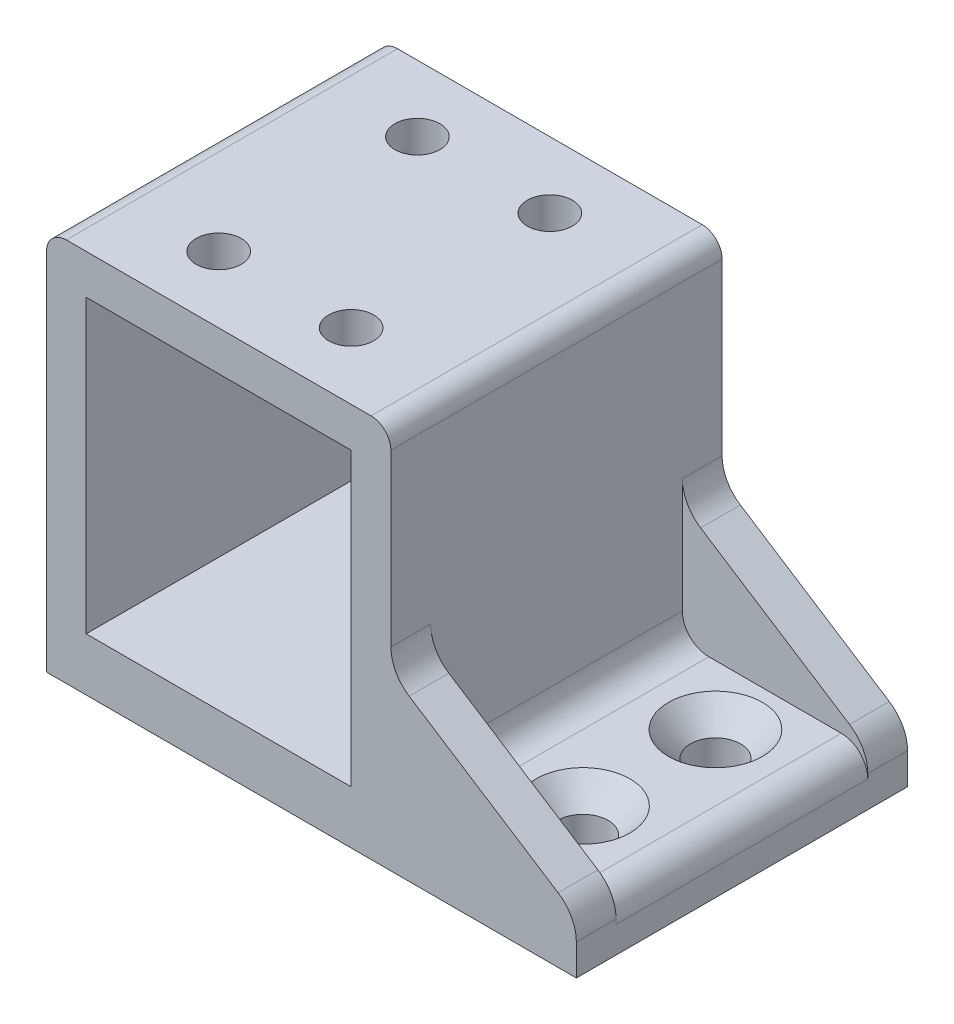
ISO-10303-21;
HEADER;
FILE_DESCRIPTION(('STEP AP214'),'2;1');
FILE_NAME('part.step','',(''),(''),'','','');
FILE_SCHEMA(('AUTOMOTIVE_DESIGN { 1 0 10303 214 1 1 1 1 }'));
ENDSEC;
DATA;
#1=APPLICATION_CONTEXT('core data for automotive mechanical design processes');
#2=APPLICATION_PROTOCOL_DEFINITION('international standard','automotive_design',2000,#1);
#3=PRODUCT_CONTEXT('',#1,'mechanical');
#4=PRODUCT('Part','Part','',(#3));
#5=PRODUCT_RELATED_PRODUCT_CATEGORY('part','',(#4));
#6=PRODUCT_DEFINITION_FORMATION('','',#4);
#7=PRODUCT_DEFINITION_CONTEXT('part definition',#1,'design');
#8=PRODUCT_DEFINITION('design','',#6,#7);
#9=PRODUCT_DEFINITION_SHAPE('','',#8);
#10=(LENGTH_UNIT() NAMED_UNIT(*) SI_UNIT(.MILLI.,.METRE.));
#11=(NAMED_UNIT(*) PLANE_ANGLE_UNIT() SI_UNIT($,.RADIAN.));
#12=(NAMED_UNIT(*) SI_UNIT($,.STERADIAN.) SOLID_ANGLE_UNIT());
#13=UNCERTAINTY_MEASURE_WITH_UNIT(LENGTH_MEASURE(1.E-05),#10,'distance_accuracy_value','');
#14=(GEOMETRIC_REPRESENTATION_CONTEXT(3) GLOBAL_UNCERTAINTY_ASSIGNED_CONTEXT((#13)) GLOBAL_UNIT_ASSIGNED_CONTEXT((#10,
#11,#12)) REPRESENTATION_CONTEXT('',''));
#15=CARTESIAN_POINT('',(0.,0.,0.));
#16=DIRECTION('',(0.,0.,1.));
#17=DIRECTION('',(1.,0.,0.));
#18=AXIS2_PLACEMENT_3D('',#15,#16,#17);
#19=CARTESIAN_POINT('',(0.,0.,25.));
#20=DIRECTION('',(-1.,0.,0.));
#21=DIRECTION('',(0.,0.,1.));
#22=AXIS2_PLACEMENT_3D('',#19,#20,#21);
#23=PLANE('',#22);
#24=DIRECTION('',(0.,1.,0.));
#25=VECTOR('',#24,1.);
#26=CARTESIAN_POINT('',(0.,0.,0.));
#27=LINE('',#26,#25);
#28=CARTESIAN_POINT('',(0.,10.6378536379485,0.));
#29=VERTEX_POINT('',#28);
#30=CARTESIAN_POINT('',(0.,23.5,0.));
#31=VERTEX_POINT('',#30);
#32=EDGE_CURVE('E202',#29,#31,#27,.T.);
#33=ORIENTED_EDGE('',*,*,#32,.T.);
#34=DIRECTION('',(0.,0.,-1.));
#35=VECTOR('',#34,1.);
#36=CARTESIAN_POINT('',(0.,23.5,25.));
#37=LINE('',#36,#35);
#38=CARTESIAN_POINT('',(0.,23.5,25.));
#39=VERTEX_POINT('',#38);
#40=EDGE_CURVE('E11',#31,#39,#37,.F.);
#41=ORIENTED_EDGE('',*,*,#40,.T.);
#42=DIRECTION('',(0.,1.,0.));
#43=VECTOR('',#42,1.);
#44=CARTESIAN_POINT('',(0.,0.,25.));
#45=LINE('',#44,#43);
#46=CARTESIAN_POINT('',(0.,10.6378536379485,25.));
#47=VERTEX_POINT('',#46);
#48=EDGE_CURVE('E228',#47,#39,#45,.T.);
#49=ORIENTED_EDGE('',*,*,#48,.F.);
#50=DIRECTION('',(0.,0.,1.));
#51=VECTOR('',#50,1.);
#52=CARTESIAN_POINT('',(0.,10.6378536379485,25.));
#53=LINE('',#52,#51);
#54=CARTESIAN_POINT('',(0.,10.6378536379485,22.));
#55=VERTEX_POINT('',#54);
#56=EDGE_CURVE('E255',#47,#55,#53,.F.);
#57=ORIENTED_EDGE('',*,*,#56,.T.);
#58=DIRECTION('',(0.,-1.,0.));
#59=VECTOR('',#58,1.);
#60=CARTESIAN_POINT('',(0.,0.,22.));
#61=LINE('',#60,#59);
#62=CARTESIAN_POINT('',(0.,2.,22.));
#63=VERTEX_POINT('',#62);
#64=EDGE_CURVE('E365',#55,#63,#61,.T.);
#65=ORIENTED_EDGE('',*,*,#64,.T.);
#66=DIRECTION('',(0.,0.,-1.));
#67=VECTOR('',#66,1.);
#68=CARTESIAN_POINT('',(0.,2.,3.));
#69=LINE('',#68,#67);
#70=CARTESIAN_POINT('',(0.,2.,3.));
#71=VERTEX_POINT('',#70);
#72=EDGE_CURVE('E278',#63,#71,#69,.T.);
#73=ORIENTED_EDGE('',*,*,#72,.T.);
#74=DIRECTION('',(0.,-1.,0.));
#75=VECTOR('',#74,1.);
#76=CARTESIAN_POINT('',(0.,9.,3.));
#77=LINE('',#76,#75);
#78=CARTESIAN_POINT('',(0.,10.6378536379485,3.));
#79=VERTEX_POINT('',#78);
#80=EDGE_CURVE('E356',#79,#71,#77,.T.);
#81=ORIENTED_EDGE('',*,*,#80,.F.);
#82=DIRECTION('',(0.,0.,-1.));
#83=VECTOR('',#82,1.);
#84=CARTESIAN_POINT('',(0.,10.6378536379485,0.));
#85=LINE('',#84,#83);
#86=EDGE_CURVE('E258',#79,#29,#85,.T.);
#87=ORIENTED_EDGE('',*,*,#86,.T.);
#88=EDGE_LOOP('',(#33,#41,#49,#57,#65,#73,#81,#87));
#89=FACE_BOUND('',#88,.T.);
#90=ADVANCED_FACE('F32',(#89),#23,.F.);
#91=CARTESIAN_POINT('',(0.,0.,25.));
#92=DIRECTION('',(0.,0.,-1.));
#93=DIRECTION('',(-1.,0.,0.));
#94=AXIS2_PLACEMENT_3D('',#91,#92,#93);
#95=PLANE('',#94);
#96=DIRECTION('',(-1.,0.,0.));
#97=VECTOR('',#96,1.);
#98=CARTESIAN_POINT('',(0.,25.,25.));
#99=LINE('',#98,#97);
#100=CARTESIAN_POINT('',(-1.5,25.,25.));
#101=VERTEX_POINT('',#100);
#102=CARTESIAN_POINT('',(-24.5,25.,25.));
#103=VERTEX_POINT('',#102);
#104=EDGE_CURVE('E230',#101,#103,#99,.T.);
#105=ORIENTED_EDGE('',*,*,#104,.T.);
#106=CARTESIAN_POINT('',(-24.5,23.5,25.));
#107=DIRECTION('',(0.,0.,-1.));
#108=DIRECTION('',(-1.,0.,0.));
#109=AXIS2_PLACEMENT_3D('',#106,#107,#108);
#110=CIRCLE('',#109,1.5);
#111=CARTESIAN_POINT('',(-26.,23.5,25.));
#112=VERTEX_POINT('',#111);
#113=EDGE_CURVE('E40',#103,#112,#110,.F.);
#114=ORIENTED_EDGE('',*,*,#113,.T.);
#115=DIRECTION('',(0.,-1.,0.));
#116=VECTOR('',#115,1.);
#117=CARTESIAN_POINT('',(-26.,25.,25.));
#118=LINE('',#117,#116);
#119=CARTESIAN_POINT('',(-26.,-4.,25.));
#120=VERTEX_POINT('',#119);
#121=EDGE_CURVE('E233',#112,#120,#118,.T.);
#122=ORIENTED_EDGE('',*,*,#121,.T.);
#123=DIRECTION('',(1.,0.,0.));
#124=VECTOR('',#123,1.);
#125=CARTESIAN_POINT('',(-26.,-4.,25.));
#126=LINE('',#125,#124);
#127=CARTESIAN_POINT('',(14.,-4.,25.));
#128=VERTEX_POINT('',#127);
#129=EDGE_CURVE('E235',#120,#128,#126,.T.);
#130=ORIENTED_EDGE('',*,*,#129,.T.);
#131=DIRECTION('',(0.,1.,0.));
#132=VECTOR('',#131,1.);
#133=CARTESIAN_POINT('',(14.,-4.,25.));
#134=LINE('',#133,#132);
#135=CARTESIAN_POINT('',(14.,-1.63785363794855,25.));
#136=VERTEX_POINT('',#135);
#137=EDGE_CURVE('E237',#128,#136,#134,.T.);
#138=ORIENTED_EDGE('',*,*,#137,.T.);
#139=CARTESIAN_POINT('',(11.,-1.63785363794855,25.));
#140=DIRECTION('',(0.,0.,-1.));
#141=DIRECTION('',(-1.,0.,0.));
#142=AXIS2_PLACEMENT_3D('',#139,#140,#141);
#143=CIRCLE('',#142,3.);
#144=CARTESIAN_POINT('',(12.6222727739405,0.885681788181112,25.));
#145=VERTEX_POINT('',#144);
#146=EDGE_CURVE('E319',#136,#145,#143,.F.);
#147=ORIENTED_EDGE('',*,*,#146,.T.);
#148=DIRECTION('',(-0.841178475376554,0.540757591313499,0.));
#149=VECTOR('',#148,1.);
#150=CARTESIAN_POINT('',(4.09386281588448,6.36823104693141,25.));
#151=LINE('',#150,#149);
#152=CARTESIAN_POINT('',(1.3777272260595,8.11431821181889,25.));
#153=VERTEX_POINT('',#152);
#154=EDGE_CURVE('E375',#145,#153,#151,.T.);
#155=ORIENTED_EDGE('',*,*,#154,.T.);
#156=CARTESIAN_POINT('',(3.,10.6378536379485,25.));
#157=DIRECTION('',(0.,0.,-1.));
#158=DIRECTION('',(-1.,0.,0.));
#159=AXIS2_PLACEMENT_3D('',#156,#157,#158);
#160=CIRCLE('',#159,3.);
#161=EDGE_CURVE('E273',#153,#47,#160,.T.);
#162=ORIENTED_EDGE('',*,*,#161,.T.);
#163=ORIENTED_EDGE('',*,*,#48,.T.);
#164=CARTESIAN_POINT('',(-1.5,23.5,25.));
#165=DIRECTION('',(0.,0.,-1.));
#166=DIRECTION('',(-1.,0.,0.));
#167=AXIS2_PLACEMENT_3D('',#164,#165,#166);
#168=CIRCLE('',#167,1.5);
#169=EDGE_CURVE('E332',#39,#101,#168,.F.);
#170=ORIENTED_EDGE('',*,*,#169,.T.);
#171=EDGE_LOOP('',(#105,#114,#122,#130,#138,#147,#155,#162,#163,#170));
#172=FACE_BOUND('',#171,.T.);
#173=DIRECTION('',(-1.,0.,0.));
#174=VECTOR('',#173,1.);
#175=CARTESIAN_POINT('',(-3.,22.,25.));
#176=LINE('',#175,#174);
#177=CARTESIAN_POINT('',(-3.,22.,25.));
#178=VERTEX_POINT('',#177);
#179=CARTESIAN_POINT('',(-23.,22.,25.));
#180=VERTEX_POINT('',#179);
#181=EDGE_CURVE('E184',#178,#180,#176,.T.);
#182=ORIENTED_EDGE('',*,*,#181,.F.);
#183=DIRECTION('',(0.,1.,0.));
#184=VECTOR('',#183,1.);
#185=CARTESIAN_POINT('',(-3.,22.,25.));
#186=LINE('',#185,#184);
#187=CARTESIAN_POINT('',(-3.,0.,25.));
#188=VERTEX_POINT('',#187);
#189=EDGE_CURVE('E210',#188,#178,#186,.T.);
#190=ORIENTED_EDGE('',*,*,#189,.F.);
#191=DIRECTION('',(1.,0.,0.));
#192=VECTOR('',#191,1.);
#193=CARTESIAN_POINT('',(-23.,0.,25.));
#194=LINE('',#193,#192);
#195=CARTESIAN_POINT('',(-23.,0.,25.));
#196=VERTEX_POINT('',#195);
#197=EDGE_CURVE('E208',#196,#188,#194,.T.);
#198=ORIENTED_EDGE('',*,*,#197,.F.);
#199=DIRECTION('',(0.,-1.,0.));
#200=VECTOR('',#199,1.);
#201=CARTESIAN_POINT('',(-23.,22.,25.));
#202=LINE('',#201,#200);
#203=EDGE_CURVE('E194',#180,#196,#202,.T.);
#204=ORIENTED_EDGE('',*,*,#203,.F.);
#205=EDGE_LOOP('',(#182,#190,#198,#204));
#206=FACE_BOUND('',#205,.T.);
#207=ADVANCED_FACE('F206',(#172,#206),#95,.F.);
#208=CARTESIAN_POINT('',(0.,0.,0.));
#209=DIRECTION('',(0.,0.,-1.));
#210=DIRECTION('',(-1.,0.,0.));
#211=AXIS2_PLACEMENT_3D('',#208,#209,#210);
#212=PLANE('',#211);
#213=DIRECTION('',(0.,-1.,0.));
#214=VECTOR('',#213,1.);
#215=CARTESIAN_POINT('',(-26.,25.,0.));
#216=LINE('',#215,#214);
#217=CARTESIAN_POINT('',(-26.,23.5,0.));
#218=VERTEX_POINT('',#217);
#219=CARTESIAN_POINT('',(-26.,-4.,0.));
#220=VERTEX_POINT('',#219);
#221=EDGE_CURVE('E244',#218,#220,#216,.T.);
#222=ORIENTED_EDGE('',*,*,#221,.F.);
#223=CARTESIAN_POINT('',(-24.5,23.5,0.));
#224=DIRECTION('',(0.,0.,-1.));
#225=DIRECTION('',(-1.,0.,0.));
#226=AXIS2_PLACEMENT_3D('',#223,#224,#225);
#227=CIRCLE('',#226,1.5);
#228=CARTESIAN_POINT('',(-24.5,25.,0.));
#229=VERTEX_POINT('',#228);
#230=EDGE_CURVE('E326',#218,#229,#227,.T.);
#231=ORIENTED_EDGE('',*,*,#230,.T.);
#232=DIRECTION('',(-1.,0.,0.));
#233=VECTOR('',#232,1.);
#234=CARTESIAN_POINT('',(0.,25.,0.));
#235=LINE('',#234,#233);
#236=CARTESIAN_POINT('',(-1.5,25.,0.));
#237=VERTEX_POINT('',#236);
#238=EDGE_CURVE('E242',#237,#229,#235,.T.);
#239=ORIENTED_EDGE('',*,*,#238,.F.);
#240=CARTESIAN_POINT('',(-1.5,23.5,0.));
#241=DIRECTION('',(0.,0.,-1.));
#242=DIRECTION('',(-1.,0.,0.));
#243=AXIS2_PLACEMENT_3D('',#240,#241,#242);
#244=CIRCLE('',#243,1.5);
#245=EDGE_CURVE('E324',#237,#31,#244,.T.);
#246=ORIENTED_EDGE('',*,*,#245,.T.);
#247=ORIENTED_EDGE('',*,*,#32,.F.);
#248=CARTESIAN_POINT('',(3.,10.6378536379485,0.));
#249=DIRECTION('',(0.,0.,-1.));
#250=DIRECTION('',(-1.,0.,0.));
#251=AXIS2_PLACEMENT_3D('',#248,#249,#250);
#252=CIRCLE('',#251,3.);
#253=CARTESIAN_POINT('',(1.37772722605951,8.11431821181889,0.));
#254=VERTEX_POINT('',#253);
#255=EDGE_CURVE('E267',#29,#254,#252,.F.);
#256=ORIENTED_EDGE('',*,*,#255,.T.);
#257=DIRECTION('',(-0.841178475376554,0.540757591313499,0.));
#258=VECTOR('',#257,1.);
#259=CARTESIAN_POINT('',(14.,0.,0.));
#260=LINE('',#259,#258);
#261=CARTESIAN_POINT('',(12.6222727739405,0.88568178818111,0.));
#262=VERTEX_POINT('',#261);
#263=EDGE_CURVE('E362',#262,#254,#260,.T.);
#264=ORIENTED_EDGE('',*,*,#263,.F.);
#265=CARTESIAN_POINT('',(11.,-1.63785363794855,0.));
#266=DIRECTION('',(0.,0.,-1.));
#267=DIRECTION('',(-1.,0.,0.));
#268=AXIS2_PLACEMENT_3D('',#265,#266,#267);
#269=CIRCLE('',#268,3.);
#270=CARTESIAN_POINT('',(14.,-1.63785363794855,0.));
#271=VERTEX_POINT('',#270);
#272=EDGE_CURVE('E306',#262,#271,#269,.T.);
#273=ORIENTED_EDGE('',*,*,#272,.T.);
#274=DIRECTION('',(0.,1.,0.));
#275=VECTOR('',#274,1.);
#276=CARTESIAN_POINT('',(14.,-4.,0.));
#277=LINE('',#276,#275);
#278=CARTESIAN_POINT('',(14.,-4.,0.));
#279=VERTEX_POINT('',#278);
#280=EDGE_CURVE('E231',#279,#271,#277,.T.);
#281=ORIENTED_EDGE('',*,*,#280,.F.);
#282=DIRECTION('',(1.,0.,0.));
#283=VECTOR('',#282,1.);
#284=CARTESIAN_POINT('',(-26.,-4.,0.));
#285=LINE('',#284,#283);
#286=EDGE_CURVE('E246',#220,#279,#285,.T.);
#287=ORIENTED_EDGE('',*,*,#286,.F.);
#288=EDGE_LOOP('',(#222,#231,#239,#246,#247,#256,#264,#273,#281,#287));
#289=FACE_BOUND('',#288,.T.);
#290=DIRECTION('',(0.,1.,0.));
#291=VECTOR('',#290,1.);
#292=CARTESIAN_POINT('',(-3.,22.,0.));
#293=LINE('',#292,#291);
#294=CARTESIAN_POINT('',(-3.,0.,0.));
#295=VERTEX_POINT('',#294);
#296=CARTESIAN_POINT('',(-3.,22.,0.));
#297=VERTEX_POINT('',#296);
#298=EDGE_CURVE('E195',#295,#297,#293,.T.);
#299=ORIENTED_EDGE('',*,*,#298,.T.);
#300=DIRECTION('',(-1.,0.,0.));
#301=VECTOR('',#300,1.);
#302=CARTESIAN_POINT('',(-3.,22.,0.));
#303=LINE('',#302,#301);
#304=CARTESIAN_POINT('',(-23.,22.,0.));
#305=VERTEX_POINT('',#304);
#306=EDGE_CURVE('E215',#297,#305,#303,.T.);
#307=ORIENTED_EDGE('',*,*,#306,.T.);
#308=DIRECTION('',(0.,-1.,0.));
#309=VECTOR('',#308,1.);
#310=CARTESIAN_POINT('',(-23.,22.,0.));
#311=LINE('',#310,#309);
#312=CARTESIAN_POINT('',(-23.,0.,0.));
#313=VERTEX_POINT('',#312);
#314=EDGE_CURVE('E201',#305,#313,#311,.T.);
#315=ORIENTED_EDGE('',*,*,#314,.T.);
#316=DIRECTION('',(1.,0.,0.));
#317=VECTOR('',#316,1.);
#318=CARTESIAN_POINT('',(-23.,0.,0.));
#319=LINE('',#318,#317);
#320=EDGE_CURVE('E219',#313,#295,#319,.T.);
#321=ORIENTED_EDGE('',*,*,#320,.T.);
#322=EDGE_LOOP('',(#299,#307,#315,#321));
#323=FACE_BOUND('',#322,.T.);
#324=ADVANCED_FACE('F346',(#289,#323),#212,.T.);
#325=CARTESIAN_POINT('',(14.,0.,25.));
#326=DIRECTION('',(0.,-1.,0.));
#327=DIRECTION('',(1.,0.,0.));
#328=AXIS2_PLACEMENT_3D('',#325,#326,#327);
#329=PLANE('',#328);
#330=CARTESIAN_POINT('',(7.,0.,17.5));
#331=DIRECTION('',(0.,1.,0.));
#332=DIRECTION('',(0.,0.,1.));
#333=AXIS2_PLACEMENT_3D('',#330,#331,#332);
#334=CIRCLE('',#333,3.5433);
#335=CARTESIAN_POINT('',(7.,0.,21.0433));
#336=VERTEX_POINT('',#335);
#337=EDGE_CURVE('E420',#336,#336,#334,.T.);
#338=ORIENTED_EDGE('',*,*,#337,.F.);
#339=EDGE_LOOP('',(#338));
#340=FACE_BOUND('',#339,.T.);
#341=CARTESIAN_POINT('',(7.,0.,7.5));
#342=DIRECTION('',(0.,1.,0.));
#343=DIRECTION('',(0.,0.,1.));
#344=AXIS2_PLACEMENT_3D('',#341,#342,#343);
#345=CIRCLE('',#344,3.5433);
#346=CARTESIAN_POINT('',(7.,0.,11.0433));
#347=VERTEX_POINT('',#346);
#348=EDGE_CURVE('E411',#347,#347,#345,.T.);
#349=ORIENTED_EDGE('',*,*,#348,.F.);
#350=EDGE_LOOP('',(#349));
#351=FACE_BOUND('',#350,.T.);
#352=DIRECTION('',(1.,0.,0.));
#353=VECTOR('',#352,1.);
#354=CARTESIAN_POINT('',(0.,0.,3.));
#355=LINE('',#354,#353);
#356=CARTESIAN_POINT('',(2.,0.,3.));
#357=VERTEX_POINT('',#356);
#358=CARTESIAN_POINT('',(12.,0.,3.));
#359=VERTEX_POINT('',#358);
#360=EDGE_CURVE('E366',#357,#359,#355,.T.);
#361=ORIENTED_EDGE('',*,*,#360,.F.);
#362=DIRECTION('',(0.,0.,-1.));
#363=VECTOR('',#362,1.);
#364=CARTESIAN_POINT('',(2.,0.,22.));
#365=LINE('',#364,#363);
#366=CARTESIAN_POINT('',(2.,0.,22.));
#367=VERTEX_POINT('',#366);
#368=EDGE_CURVE('E286',#357,#367,#365,.F.);
#369=ORIENTED_EDGE('',*,*,#368,.T.);
#370=DIRECTION('',(1.,0.,0.));
#371=VECTOR('',#370,1.);
#372=CARTESIAN_POINT('',(0.,0.,22.));
#373=LINE('',#372,#371);
#374=CARTESIAN_POINT('',(12.,0.,22.));
#375=VERTEX_POINT('',#374);
#376=EDGE_CURVE('E376',#367,#375,#373,.T.);
#377=ORIENTED_EDGE('',*,*,#376,.T.);
#378=DIRECTION('',(0.,0.,-1.));
#379=VECTOR('',#378,1.);
#380=CARTESIAN_POINT('',(12.,0.,25.));
#381=LINE('',#380,#379);
#382=EDGE_CURVE('E283',#375,#359,#381,.T.);
#383=ORIENTED_EDGE('',*,*,#382,.T.);
#384=EDGE_LOOP('',(#361,#369,#377,#383));
#385=FACE_BOUND('',#384,.T.);
#386=ADVANCED_FACE('F426',(#340,#351,#385),#329,.F.);
#387=CARTESIAN_POINT('',(0.,25.,25.));
#388=DIRECTION('',(0.,-1.,0.));
#389=DIRECTION('',(1.,0.,0.));
#390=AXIS2_PLACEMENT_3D('',#387,#388,#389);
#391=PLANE('',#390);
#392=CARTESIAN_POINT('',(-8.,25.,5.));
#393=DIRECTION('',(0.,1.,0.));
#394=DIRECTION('',(0.,0.,1.));
#395=AXIS2_PLACEMENT_3D('',#392,#393,#394);
#396=CIRCLE('',#395,1.7);
#397=CARTESIAN_POINT('',(-8.,25.,6.7));
#398=VERTEX_POINT('',#397);
#399=EDGE_CURVE('E402',#398,#398,#396,.T.);
#400=ORIENTED_EDGE('',*,*,#399,.F.);
#401=EDGE_LOOP('',(#400));
#402=FACE_BOUND('',#401,.T.);
#403=CARTESIAN_POINT('',(-8.,25.,20.));
#404=DIRECTION('',(0.,1.,0.));
#405=DIRECTION('',(0.,0.,1.));
#406=AXIS2_PLACEMENT_3D('',#403,#404,#405);
#407=CIRCLE('',#406,1.7);
#408=CARTESIAN_POINT('',(-8.,25.,21.7));
#409=VERTEX_POINT('',#408);
#410=EDGE_CURVE('E396',#409,#409,#407,.T.);
#411=ORIENTED_EDGE('',*,*,#410,.F.);
#412=EDGE_LOOP('',(#411));
#413=FACE_BOUND('',#412,.T.);
#414=CARTESIAN_POINT('',(-18.,25.,20.));
#415=DIRECTION('',(0.,1.,0.));
#416=DIRECTION('',(0.,0.,1.));
#417=AXIS2_PLACEMENT_3D('',#414,#415,#416);
#418=CIRCLE('',#417,1.7);
#419=CARTESIAN_POINT('',(-18.,25.,21.7));
#420=VERTEX_POINT('',#419);
#421=EDGE_CURVE('E390',#420,#420,#418,.T.);
#422=ORIENTED_EDGE('',*,*,#421,.F.);
#423=EDGE_LOOP('',(#422));
#424=FACE_BOUND('',#423,.T.);
#425=CARTESIAN_POINT('',(-18.,25.,5.));
#426=DIRECTION('',(0.,1.,0.));
#427=DIRECTION('',(0.,0.,1.));
#428=AXIS2_PLACEMENT_3D('',#425,#426,#427);
#429=CIRCLE('',#428,1.7);
#430=CARTESIAN_POINT('',(-18.,25.,6.7));
#431=VERTEX_POINT('',#430);
#432=EDGE_CURVE('E384',#431,#431,#429,.T.);
#433=ORIENTED_EDGE('',*,*,#432,.F.);
#434=EDGE_LOOP('',(#433));
#435=FACE_BOUND('',#434,.T.);
#436=ORIENTED_EDGE('',*,*,#238,.T.);
#437=DIRECTION('',(0.,0.,-1.));
#438=VECTOR('',#437,1.);
#439=CARTESIAN_POINT('',(-24.5,25.,25.));
#440=LINE('',#439,#438);
#441=EDGE_CURVE('E53',#229,#103,#440,.F.);
#442=ORIENTED_EDGE('',*,*,#441,.T.);
#443=ORIENTED_EDGE('',*,*,#104,.F.);
#444=DIRECTION('',(0.,0.,-1.));
#445=VECTOR('',#444,1.);
#446=CARTESIAN_POINT('',(-1.5,25.,25.));
#447=LINE('',#446,#445);
#448=EDGE_CURVE('E328',#101,#237,#447,.T.);
#449=ORIENTED_EDGE('',*,*,#448,.T.);
#450=EDGE_LOOP('',(#436,#442,#443,#449));
#451=FACE_BOUND('',#450,.T.);
#452=ADVANCED_FACE('F349',(#402,#413,#424,#435,#451),#391,.F.);
#453=CARTESIAN_POINT('',(-26.,25.,25.));
#454=DIRECTION('',(1.,0.,0.));
#455=DIRECTION('',(0.,1.,0.));
#456=AXIS2_PLACEMENT_3D('',#453,#454,#455);
#457=PLANE('',#456);
#458=ORIENTED_EDGE('',*,*,#121,.F.);
#459=DIRECTION('',(0.,0.,-1.));
#460=VECTOR('',#459,1.);
#461=CARTESIAN_POINT('',(-26.,23.5,25.));
#462=LINE('',#461,#460);
#463=EDGE_CURVE('E321',#112,#218,#462,.T.);
#464=ORIENTED_EDGE('',*,*,#463,.T.);
#465=ORIENTED_EDGE('',*,*,#221,.T.);
#466=DIRECTION('',(0.,0.,-1.));
#467=VECTOR('',#466,1.);
#468=CARTESIAN_POINT('',(-26.,-4.,25.));
#469=LINE('',#468,#467);
#470=EDGE_CURVE('E252',#120,#220,#469,.T.);
#471=ORIENTED_EDGE('',*,*,#470,.F.);
#472=EDGE_LOOP('',(#458,#464,#465,#471));
#473=FACE_BOUND('',#472,.T.);
#474=ADVANCED_FACE('F340',(#473),#457,.F.);
#475=CARTESIAN_POINT('',(-26.,-4.,25.));
#476=DIRECTION('',(0.,1.,0.));
#477=DIRECTION('',(0.,0.,1.));
#478=AXIS2_PLACEMENT_3D('',#475,#476,#477);
#479=PLANE('',#478);
#480=CARTESIAN_POINT('',(7.,-4.0000000000001,17.5));
#481=DIRECTION('',(0.,1.,0.));
#482=DIRECTION('',(0.,0.,1.));
#483=AXIS2_PLACEMENT_3D('',#480,#481,#482);
#484=CIRCLE('',#483,1.89865);
#485=CARTESIAN_POINT('',(7.,-4.0000000000001,19.39865));
#486=VERTEX_POINT('',#485);
#487=EDGE_CURVE('E414',#486,#486,#484,.T.);
#488=ORIENTED_EDGE('',*,*,#487,.T.);
#489=EDGE_LOOP('',(#488));
#490=FACE_BOUND('',#489,.T.);
#491=CARTESIAN_POINT('',(7.,-4.0000000000001,7.5));
#492=DIRECTION('',(0.,1.,0.));
#493=DIRECTION('',(0.,0.,1.));
#494=AXIS2_PLACEMENT_3D('',#491,#492,#493);
#495=CIRCLE('',#494,1.89865);
#496=CARTESIAN_POINT('',(7.,-4.0000000000001,9.39865));
#497=VERTEX_POINT('',#496);
#498=EDGE_CURVE('E405',#497,#497,#495,.T.);
#499=ORIENTED_EDGE('',*,*,#498,.T.);
#500=EDGE_LOOP('',(#499));
#501=FACE_BOUND('',#500,.T.);
#502=ORIENTED_EDGE('',*,*,#286,.T.);
#503=DIRECTION('',(0.,0.,-1.));
#504=VECTOR('',#503,1.);
#505=CARTESIAN_POINT('',(14.,-4.,25.));
#506=LINE('',#505,#504);
#507=EDGE_CURVE('E240',#128,#279,#506,.T.);
#508=ORIENTED_EDGE('',*,*,#507,.F.);
#509=ORIENTED_EDGE('',*,*,#129,.F.);
#510=ORIENTED_EDGE('',*,*,#470,.T.);
#511=EDGE_LOOP('',(#502,#508,#509,#510));
#512=FACE_BOUND('',#511,.T.);
#513=ADVANCED_FACE('F463',(#490,#501,#512),#479,.F.);
#514=CARTESIAN_POINT('',(14.,-4.,25.));
#515=DIRECTION('',(-1.,0.,0.));
#516=DIRECTION('',(0.,0.,1.));
#517=AXIS2_PLACEMENT_3D('',#514,#515,#516);
#518=PLANE('',#517);
#519=ORIENTED_EDGE('',*,*,#280,.T.);
#520=DIRECTION('',(0.,0.,-1.));
#521=VECTOR('',#520,1.);
#522=CARTESIAN_POINT('',(14.,-1.63785363794855,25.));
#523=LINE('',#522,#521);
#524=CARTESIAN_POINT('',(14.,-1.63785363794855,3.));
#525=VERTEX_POINT('',#524);
#526=EDGE_CURVE('E310',#271,#525,#523,.F.);
#527=ORIENTED_EDGE('',*,*,#526,.T.);
#528=DIRECTION('',(0.,-1.,0.));
#529=VECTOR('',#528,1.);
#530=CARTESIAN_POINT('',(14.,0.,3.));
#531=LINE('',#530,#529);
#532=CARTESIAN_POINT('',(14.,-2.,3.));
#533=VERTEX_POINT('',#532);
#534=EDGE_CURVE('E296',#525,#533,#531,.T.);
#535=ORIENTED_EDGE('',*,*,#534,.T.);
#536=DIRECTION('',(0.,0.,-1.));
#537=VECTOR('',#536,1.);
#538=CARTESIAN_POINT('',(14.,-2.,25.));
#539=LINE('',#538,#537);
#540=CARTESIAN_POINT('',(14.,-2.,22.));
#541=VERTEX_POINT('',#540);
#542=EDGE_CURVE('E293',#533,#541,#539,.F.);
#543=ORIENTED_EDGE('',*,*,#542,.T.);
#544=DIRECTION('',(0.,1.,0.));
#545=VECTOR('',#544,1.);
#546=CARTESIAN_POINT('',(14.,0.,22.));
#547=LINE('',#546,#545);
#548=CARTESIAN_POINT('',(14.,-1.63785363794855,22.));
#549=VERTEX_POINT('',#548);
#550=EDGE_CURVE('E290',#541,#549,#547,.T.);
#551=ORIENTED_EDGE('',*,*,#550,.T.);
#552=DIRECTION('',(0.,0.,-1.));
#553=VECTOR('',#552,1.);
#554=CARTESIAN_POINT('',(14.,-1.63785363794855,25.));
#555=LINE('',#554,#553);
#556=EDGE_CURVE('E308',#549,#136,#555,.F.);
#557=ORIENTED_EDGE('',*,*,#556,.T.);
#558=ORIENTED_EDGE('',*,*,#137,.F.);
#559=ORIENTED_EDGE('',*,*,#507,.T.);
#560=EDGE_LOOP('',(#519,#527,#535,#543,#551,#557,#558,#559));
#561=FACE_BOUND('',#560,.T.);
#562=ADVANCED_FACE('F460',(#561),#518,.F.);
#563=CARTESIAN_POINT('',(-3.,22.,25.));
#564=DIRECTION('',(0.,-1.,0.));
#565=DIRECTION('',(0.,0.,-1.));
#566=AXIS2_PLACEMENT_3D('',#563,#564,#565);
#567=PLANE('',#566);
#568=CARTESIAN_POINT('',(-8.,22.,5.));
#569=DIRECTION('',(0.,-1.,0.));
#570=DIRECTION('',(0.,0.,-1.));
#571=AXIS2_PLACEMENT_3D('',#568,#569,#570);
#572=CIRCLE('',#571,1.7);
#573=CARTESIAN_POINT('',(-8.,22.,3.3));
#574=VERTEX_POINT('',#573);
#575=EDGE_CURVE('E399',#574,#574,#572,.T.);
#576=ORIENTED_EDGE('',*,*,#575,.F.);
#577=EDGE_LOOP('',(#576));
#578=FACE_BOUND('',#577,.T.);
#579=CARTESIAN_POINT('',(-8.,22.,20.));
#580=DIRECTION('',(0.,-1.,0.));
#581=DIRECTION('',(0.,0.,-1.));
#582=AXIS2_PLACEMENT_3D('',#579,#580,#581);
#583=CIRCLE('',#582,1.7);
#584=CARTESIAN_POINT('',(-8.,22.,18.3));
#585=VERTEX_POINT('',#584);
#586=EDGE_CURVE('E393',#585,#585,#583,.T.);
#587=ORIENTED_EDGE('',*,*,#586,.F.);
#588=EDGE_LOOP('',(#587));
#589=FACE_BOUND('',#588,.T.);
#590=CARTESIAN_POINT('',(-18.,22.,20.));
#591=DIRECTION('',(0.,-1.,0.));
#592=DIRECTION('',(0.,0.,-1.));
#593=AXIS2_PLACEMENT_3D('',#590,#591,#592);
#594=CIRCLE('',#593,1.7);
#595=CARTESIAN_POINT('',(-18.,22.,18.3));
#596=VERTEX_POINT('',#595);
#597=EDGE_CURVE('E387',#596,#596,#594,.T.);
#598=ORIENTED_EDGE('',*,*,#597,.F.);
#599=EDGE_LOOP('',(#598));
#600=FACE_BOUND('',#599,.T.);
#601=CARTESIAN_POINT('',(-18.,22.,5.));
#602=DIRECTION('',(0.,-1.,0.));
#603=DIRECTION('',(0.,0.,-1.));
#604=AXIS2_PLACEMENT_3D('',#601,#602,#603);
#605=CIRCLE('',#604,1.7);
#606=CARTESIAN_POINT('',(-18.,22.,3.3));
#607=VERTEX_POINT('',#606);
#608=EDGE_CURVE('E377',#607,#607,#605,.T.);
#609=ORIENTED_EDGE('',*,*,#608,.F.);
#610=EDGE_LOOP('',(#609));
#611=FACE_BOUND('',#610,.T.);
#612=ORIENTED_EDGE('',*,*,#306,.F.);
#613=DIRECTION('',(0.,0.,-1.));
#614=VECTOR('',#613,1.);
#615=CARTESIAN_POINT('',(-3.,22.,25.));
#616=LINE('',#615,#614);
#617=EDGE_CURVE('E190',#178,#297,#616,.T.);
#618=ORIENTED_EDGE('',*,*,#617,.F.);
#619=ORIENTED_EDGE('',*,*,#181,.T.);
#620=DIRECTION('',(0.,0.,-1.));
#621=VECTOR('',#620,1.);
#622=CARTESIAN_POINT('',(-23.,22.,25.));
#623=LINE('',#622,#621);
#624=EDGE_CURVE('E187',#180,#305,#623,.T.);
#625=ORIENTED_EDGE('',*,*,#624,.T.);
#626=EDGE_LOOP('',(#612,#618,#619,#625));
#627=FACE_BOUND('',#626,.T.);
#628=ADVANCED_FACE('F186',(#578,#589,#600,#611,#627),#567,.T.);
#629=CARTESIAN_POINT('',(-23.,22.,25.));
#630=DIRECTION('',(1.,0.,0.));
#631=DIRECTION('',(0.,0.,-1.));
#632=AXIS2_PLACEMENT_3D('',#629,#630,#631);
#633=PLANE('',#632);
#634=ORIENTED_EDGE('',*,*,#314,.F.);
#635=ORIENTED_EDGE('',*,*,#624,.F.);
#636=ORIENTED_EDGE('',*,*,#203,.T.);
#637=DIRECTION('',(0.,0.,-1.));
#638=VECTOR('',#637,1.);
#639=CARTESIAN_POINT('',(-23.,0.,25.));
#640=LINE('',#639,#638);
#641=EDGE_CURVE('E203',#196,#313,#640,.T.);
#642=ORIENTED_EDGE('',*,*,#641,.T.);
#643=EDGE_LOOP('',(#634,#635,#636,#642));
#644=FACE_BOUND('',#643,.T.);
#645=ADVANCED_FACE('F198',(#644),#633,.T.);
#646=CARTESIAN_POINT('',(-23.,0.,25.));
#647=DIRECTION('',(0.,1.,0.));
#648=DIRECTION('',(-1.,0.,0.));
#649=AXIS2_PLACEMENT_3D('',#646,#647,#648);
#650=PLANE('',#649);
#651=ORIENTED_EDGE('',*,*,#320,.F.);
#652=ORIENTED_EDGE('',*,*,#641,.F.);
#653=ORIENTED_EDGE('',*,*,#197,.T.);
#654=DIRECTION('',(0.,0.,-1.));
#655=VECTOR('',#654,1.);
#656=CARTESIAN_POINT('',(-3.,0.,25.));
#657=LINE('',#656,#655);
#658=EDGE_CURVE('E225',#188,#295,#657,.T.);
#659=ORIENTED_EDGE('',*,*,#658,.T.);
#660=EDGE_LOOP('',(#651,#652,#653,#659));
#661=FACE_BOUND('',#660,.T.);
#662=ADVANCED_FACE('F481',(#661),#650,.T.);
#663=CARTESIAN_POINT('',(-3.,22.,25.));
#664=DIRECTION('',(-1.,0.,0.));
#665=DIRECTION('',(0.,-1.,0.));
#666=AXIS2_PLACEMENT_3D('',#663,#664,#665);
#667=PLANE('',#666);
#668=ORIENTED_EDGE('',*,*,#298,.F.);
#669=ORIENTED_EDGE('',*,*,#658,.F.);
#670=ORIENTED_EDGE('',*,*,#189,.T.);
#671=ORIENTED_EDGE('',*,*,#617,.T.);
#672=EDGE_LOOP('',(#668,#669,#670,#671));
#673=FACE_BOUND('',#672,.T.);
#674=ADVANCED_FACE('F474',(#673),#667,.T.);
#675=CARTESIAN_POINT('',(14.,0.,3.));
#676=DIRECTION('',(-0.540757591313499,-0.841178475376554,0.));
#677=DIRECTION('',(0.841178475376554,-0.540757591313499,0.));
#678=AXIS2_PLACEMENT_3D('',#675,#676,#677);
#679=PLANE('',#678);
#680=DIRECTION('',(-0.841178475376554,0.540757591313499,0.));
#681=VECTOR('',#680,1.);
#682=CARTESIAN_POINT('',(14.,0.,3.));
#683=LINE('',#682,#681);
#684=CARTESIAN_POINT('',(12.6222727739405,0.88568178818111,3.));
#685=VERTEX_POINT('',#684);
#686=CARTESIAN_POINT('',(1.37772722605951,8.11431821181889,3.));
#687=VERTEX_POINT('',#686);
#688=EDGE_CURVE('E217',#685,#687,#683,.T.);
#689=ORIENTED_EDGE('',*,*,#688,.F.);
#690=DIRECTION('',(0.,0.,-1.));
#691=VECTOR('',#690,1.);
#692=CARTESIAN_POINT('',(12.6222727739405,0.885681788181111,3.));
#693=LINE('',#692,#691);
#694=EDGE_CURVE('E303',#685,#262,#693,.T.);
#695=ORIENTED_EDGE('',*,*,#694,.T.);
#696=ORIENTED_EDGE('',*,*,#263,.T.);
#697=DIRECTION('',(0.,0.,-1.));
#698=VECTOR('',#697,1.);
#699=CARTESIAN_POINT('',(1.3777272260595,8.11431821181889,3.));
#700=LINE('',#699,#698);
#701=EDGE_CURVE('E261',#254,#687,#700,.F.);
#702=ORIENTED_EDGE('',*,*,#701,.T.);
#703=EDGE_LOOP('',(#689,#695,#696,#702));
#704=FACE_BOUND('',#703,.T.);
#705=ADVANCED_FACE('F472',(#704),#679,.F.);
#706=CARTESIAN_POINT('',(0.,0.,3.));
#707=DIRECTION('',(0.,0.,1.));
#708=DIRECTION('',(1.,0.,0.));
#709=AXIS2_PLACEMENT_3D('',#706,#707,#708);
#710=PLANE('',#709);
#711=ORIENTED_EDGE('',*,*,#534,.F.);
#712=CARTESIAN_POINT('',(11.,-1.63785363794855,3.));
#713=DIRECTION('',(0.,0.,1.));
#714=DIRECTION('',(1.,0.,0.));
#715=AXIS2_PLACEMENT_3D('',#712,#713,#714);
#716=CIRCLE('',#715,3.);
#717=EDGE_CURVE('E312',#525,#685,#716,.T.);
#718=ORIENTED_EDGE('',*,*,#717,.T.);
#719=ORIENTED_EDGE('',*,*,#688,.T.);
#720=CARTESIAN_POINT('',(3.,10.6378536379485,3.));
#721=DIRECTION('',(0.,0.,1.));
#722=DIRECTION('',(1.,0.,0.));
#723=AXIS2_PLACEMENT_3D('',#720,#721,#722);
#724=CIRCLE('',#723,3.);
#725=EDGE_CURVE('E270',#687,#79,#724,.F.);
#726=ORIENTED_EDGE('',*,*,#725,.T.);
#727=ORIENTED_EDGE('',*,*,#80,.T.);
#728=CARTESIAN_POINT('',(2.,2.,3.));
#729=DIRECTION('',(0.,0.,1.));
#730=DIRECTION('',(1.,0.,0.));
#731=AXIS2_PLACEMENT_3D('',#728,#729,#730);
#732=CIRCLE('',#731,2.);
#733=EDGE_CURVE('E281',#71,#357,#732,.T.);
#734=ORIENTED_EDGE('',*,*,#733,.T.);
#735=ORIENTED_EDGE('',*,*,#360,.T.);
#736=CARTESIAN_POINT('',(12.,-2.,3.));
#737=DIRECTION('',(0.,0.,1.));
#738=DIRECTION('',(1.,0.,0.));
#739=AXIS2_PLACEMENT_3D('',#736,#737,#738);
#740=CIRCLE('',#739,2.);
#741=EDGE_CURVE('E298',#359,#533,#740,.F.);
#742=ORIENTED_EDGE('',*,*,#741,.T.);
#743=EDGE_LOOP('',(#711,#718,#719,#726,#727,#734,#735,#742));
#744=FACE_BOUND('',#743,.T.);
#745=ADVANCED_FACE('F471',(#744),#710,.T.);
#746=CARTESIAN_POINT('',(4.09386281588448,6.36823104693141,22.));
#747=DIRECTION('',(0.540757591313499,0.841178475376553,0.));
#748=DIRECTION('',(-0.841178475376554,0.540757591313499,0.));
#749=AXIS2_PLACEMENT_3D('',#746,#747,#748);
#750=PLANE('',#749);
#751=ORIENTED_EDGE('',*,*,#154,.F.);
#752=DIRECTION('',(0.,0.,-1.));
#753=VECTOR('',#752,1.);
#754=CARTESIAN_POINT('',(12.6222727739405,0.88568178818111,22.));
#755=LINE('',#754,#753);
#756=CARTESIAN_POINT('',(12.6222727739405,0.885681788181112,22.));
#757=VERTEX_POINT('',#756);
#758=EDGE_CURVE('E314',#145,#757,#755,.T.);
#759=ORIENTED_EDGE('',*,*,#758,.T.);
#760=DIRECTION('',(-0.841178475376554,0.540757591313499,0.));
#761=VECTOR('',#760,1.);
#762=CARTESIAN_POINT('',(4.09386281588448,6.36823104693141,22.));
#763=LINE('',#762,#761);
#764=CARTESIAN_POINT('',(1.3777272260595,8.11431821181889,22.));
#765=VERTEX_POINT('',#764);
#766=EDGE_CURVE('E369',#757,#765,#763,.T.);
#767=ORIENTED_EDGE('',*,*,#766,.T.);
#768=DIRECTION('',(0.,0.,1.));
#769=VECTOR('',#768,1.);
#770=CARTESIAN_POINT('',(1.3777272260595,8.11431821181889,22.));
#771=LINE('',#770,#769);
#772=EDGE_CURVE('E264',#765,#153,#771,.T.);
#773=ORIENTED_EDGE('',*,*,#772,.T.);
#774=EDGE_LOOP('',(#751,#759,#767,#773));
#775=FACE_BOUND('',#774,.T.);
#776=ADVANCED_FACE('F452',(#775),#750,.T.);
#777=CARTESIAN_POINT('',(0.,0.,22.));
#778=DIRECTION('',(0.,0.,-1.));
#779=DIRECTION('',(-1.,0.,0.));
#780=AXIS2_PLACEMENT_3D('',#777,#778,#779);
#781=PLANE('',#780);
#782=ORIENTED_EDGE('',*,*,#766,.F.);
#783=CARTESIAN_POINT('',(11.,-1.63785363794855,22.));
#784=DIRECTION('',(0.,0.,-1.));
#785=DIRECTION('',(-1.,0.,0.));
#786=AXIS2_PLACEMENT_3D('',#783,#784,#785);
#787=CIRCLE('',#786,3.);
#788=EDGE_CURVE('E317',#757,#549,#787,.T.);
#789=ORIENTED_EDGE('',*,*,#788,.T.);
#790=ORIENTED_EDGE('',*,*,#550,.F.);
#791=CARTESIAN_POINT('',(12.,-2.,22.));
#792=DIRECTION('',(0.,0.,-1.));
#793=DIRECTION('',(-1.,0.,0.));
#794=AXIS2_PLACEMENT_3D('',#791,#792,#793);
#795=CIRCLE('',#794,2.);
#796=EDGE_CURVE('E301',#541,#375,#795,.F.);
#797=ORIENTED_EDGE('',*,*,#796,.T.);
#798=ORIENTED_EDGE('',*,*,#376,.F.);
#799=CARTESIAN_POINT('',(2.,2.,22.));
#800=DIRECTION('',(0.,0.,-1.));
#801=DIRECTION('',(-1.,0.,0.));
#802=AXIS2_PLACEMENT_3D('',#799,#800,#801);
#803=CIRCLE('',#802,2.);
#804=EDGE_CURVE('E288',#367,#63,#803,.T.);
#805=ORIENTED_EDGE('',*,*,#804,.T.);
#806=ORIENTED_EDGE('',*,*,#64,.F.);
#807=CARTESIAN_POINT('',(3.,10.6378536379485,22.));
#808=DIRECTION('',(0.,0.,-1.));
#809=DIRECTION('',(-1.,0.,0.));
#810=AXIS2_PLACEMENT_3D('',#807,#808,#809);
#811=CIRCLE('',#810,3.);
#812=EDGE_CURVE('E275',#55,#765,#811,.F.);
#813=ORIENTED_EDGE('',*,*,#812,.T.);
#814=EDGE_LOOP('',(#782,#789,#790,#797,#798,#805,#806,#813));
#815=FACE_BOUND('',#814,.T.);
#816=ADVANCED_FACE('F443',(#815),#781,.T.);
#817=CARTESIAN_POINT('',(-18.,25.,5.));
#818=DIRECTION('',(0.,1.,0.));
#819=DIRECTION('',(0.,0.,1.));
#820=AXIS2_PLACEMENT_3D('',#817,#818,#819);
#821=CYLINDRICAL_SURFACE('',#820,1.7);
#822=ORIENTED_EDGE('',*,*,#432,.T.);
#823=EDGE_LOOP('',(#822));
#824=FACE_BOUND('',#823,.T.);
#825=ORIENTED_EDGE('',*,*,#608,.T.);
#826=EDGE_LOOP('',(#825));
#827=FACE_BOUND('',#826,.T.);
#828=ADVANCED_FACE('F580',(#824,#827),#821,.F.);
#829=CARTESIAN_POINT('',(-18.,25.,20.));
#830=DIRECTION('',(0.,1.,0.));
#831=DIRECTION('',(0.,0.,1.));
#832=AXIS2_PLACEMENT_3D('',#829,#830,#831);
#833=CYLINDRICAL_SURFACE('',#832,1.7);
#834=ORIENTED_EDGE('',*,*,#421,.T.);
#835=EDGE_LOOP('',(#834));
#836=FACE_BOUND('',#835,.T.);
#837=ORIENTED_EDGE('',*,*,#597,.T.);
#838=EDGE_LOOP('',(#837));
#839=FACE_BOUND('',#838,.T.);
#840=ADVANCED_FACE('F701',(#836,#839),#833,.F.);
#841=CARTESIAN_POINT('',(-8.,25.,20.));
#842=DIRECTION('',(0.,1.,0.));
#843=DIRECTION('',(0.,0.,1.));
#844=AXIS2_PLACEMENT_3D('',#841,#842,#843);
#845=CYLINDRICAL_SURFACE('',#844,1.7);
#846=ORIENTED_EDGE('',*,*,#410,.T.);
#847=EDGE_LOOP('',(#846));
#848=FACE_BOUND('',#847,.T.);
#849=ORIENTED_EDGE('',*,*,#586,.T.);
#850=EDGE_LOOP('',(#849));
#851=FACE_BOUND('',#850,.T.);
#852=ADVANCED_FACE('F691',(#848,#851),#845,.F.);
#853=CARTESIAN_POINT('',(-8.,25.,5.));
#854=DIRECTION('',(0.,1.,0.));
#855=DIRECTION('',(0.,0.,1.));
#856=AXIS2_PLACEMENT_3D('',#853,#854,#855);
#857=CYLINDRICAL_SURFACE('',#856,1.7);
#858=ORIENTED_EDGE('',*,*,#399,.T.);
#859=EDGE_LOOP('',(#858));
#860=FACE_BOUND('',#859,.T.);
#861=ORIENTED_EDGE('',*,*,#575,.T.);
#862=EDGE_LOOP('',(#861));
#863=FACE_BOUND('',#862,.T.);
#864=ADVANCED_FACE('F674',(#860,#863),#857,.F.);
#865=CARTESIAN_POINT('',(7.,0.,7.5));
#866=DIRECTION('',(0.,1.,0.));
#867=DIRECTION('',(0.,0.,1.));
#868=AXIS2_PLACEMENT_3D('',#865,#866,#867);
#869=CYLINDRICAL_SURFACE('',#868,1.89865);
#870=ORIENTED_EDGE('',*,*,#498,.F.);
#871=EDGE_LOOP('',(#870));
#872=FACE_BOUND('',#871,.T.);
#873=CARTESIAN_POINT('',(7.,-1.89195340093606,7.5));
#874=DIRECTION('',(0.,1.,0.));
#875=DIRECTION('',(0.,0.,1.));
#876=AXIS2_PLACEMENT_3D('',#873,#874,#875);
#877=CIRCLE('',#876,1.89865);
#878=CARTESIAN_POINT('',(7.,-1.89195340093606,9.39865));
#879=VERTEX_POINT('',#878);
#880=EDGE_CURVE('E408',#879,#879,#877,.T.);
#881=ORIENTED_EDGE('',*,*,#880,.T.);
#882=EDGE_LOOP('',(#881));
#883=FACE_BOUND('',#882,.T.);
#884=ADVANCED_FACE('F664',(#872,#883),#869,.F.);
#885=CARTESIAN_POINT('',(7.,0.,7.5));
#886=DIRECTION('',(0.,1.,0.));
#887=DIRECTION('',(0.,0.,1.));
#888=AXIS2_PLACEMENT_3D('',#885,#886,#887);
#889=CONICAL_SURFACE('',#888,3.5433,0.715584993317675);
#890=ORIENTED_EDGE('',*,*,#880,.F.);
#891=EDGE_LOOP('',(#890));
#892=FACE_BOUND('',#891,.T.);
#893=ORIENTED_EDGE('',*,*,#348,.T.);
#894=EDGE_LOOP('',(#893));
#895=FACE_BOUND('',#894,.T.);
#896=ADVANCED_FACE('F654',(#892,#895),#889,.F.);
#897=CARTESIAN_POINT('',(7.,0.,17.5));
#898=DIRECTION('',(0.,1.,0.));
#899=DIRECTION('',(0.,0.,1.));
#900=AXIS2_PLACEMENT_3D('',#897,#898,#899);
#901=CYLINDRICAL_SURFACE('',#900,1.89865);
#902=ORIENTED_EDGE('',*,*,#487,.F.);
#903=EDGE_LOOP('',(#902));
#904=FACE_BOUND('',#903,.T.);
#905=CARTESIAN_POINT('',(7.,-1.89195340093606,17.5));
#906=DIRECTION('',(0.,1.,0.));
#907=DIRECTION('',(0.,0.,1.));
#908=AXIS2_PLACEMENT_3D('',#905,#906,#907);
#909=CIRCLE('',#908,1.89865);
#910=CARTESIAN_POINT('',(7.,-1.89195340093606,19.39865));
#911=VERTEX_POINT('',#910);
#912=EDGE_CURVE('E417',#911,#911,#909,.T.);
#913=ORIENTED_EDGE('',*,*,#912,.T.);
#914=EDGE_LOOP('',(#913));
#915=FACE_BOUND('',#914,.T.);
#916=ADVANCED_FACE('F644',(#904,#915),#901,.F.);
#917=CARTESIAN_POINT('',(7.,0.,17.5));
#918=DIRECTION('',(0.,1.,0.));
#919=DIRECTION('',(0.,0.,1.));
#920=AXIS2_PLACEMENT_3D('',#917,#918,#919);
#921=CONICAL_SURFACE('',#920,3.5433,0.715584993317675);
#922=ORIENTED_EDGE('',*,*,#912,.F.);
#923=EDGE_LOOP('',(#922));
#924=FACE_BOUND('',#923,.T.);
#925=ORIENTED_EDGE('',*,*,#337,.T.);
#926=EDGE_LOOP('',(#925));
#927=FACE_BOUND('',#926,.T.);
#928=ADVANCED_FACE('F424',(#924,#927),#921,.F.);
#929=CARTESIAN_POINT('',(3.,10.6378536379485,25.));
#930=DIRECTION('',(0.,0.,1.));
#931=DIRECTION('',(1.,0.,0.));
#932=AXIS2_PLACEMENT_3D('',#929,#930,#931);
#933=CYLINDRICAL_SURFACE('',#932,3.);
#934=ORIENTED_EDGE('',*,*,#725,.F.);
#935=ORIENTED_EDGE('',*,*,#701,.F.);
#936=ORIENTED_EDGE('',*,*,#255,.F.);
#937=ORIENTED_EDGE('',*,*,#86,.F.);
#938=EDGE_LOOP('',(#934,#935,#936,#937));
#939=FACE_BOUND('',#938,.T.);
#940=ADVANCED_FACE('F359',(#939),#933,.F.);
#941=CARTESIAN_POINT('',(3.,10.6378536379485,22.));
#942=DIRECTION('',(0.,0.,1.));
#943=DIRECTION('',(1.,0.,0.));
#944=AXIS2_PLACEMENT_3D('',#941,#942,#943);
#945=CYLINDRICAL_SURFACE('',#944,3.);
#946=ORIENTED_EDGE('',*,*,#812,.F.);
#947=ORIENTED_EDGE('',*,*,#56,.F.);
#948=ORIENTED_EDGE('',*,*,#161,.F.);
#949=ORIENTED_EDGE('',*,*,#772,.F.);
#950=EDGE_LOOP('',(#946,#947,#948,#949));
#951=FACE_BOUND('',#950,.T.);
#952=ADVANCED_FACE('F449',(#951),#945,.F.);
#953=CARTESIAN_POINT('',(2.,2.,25.));
#954=DIRECTION('',(0.,0.,1.));
#955=DIRECTION('',(1.,0.,0.));
#956=AXIS2_PLACEMENT_3D('',#953,#954,#955);
#957=CYLINDRICAL_SURFACE('',#956,2.);
#958=ORIENTED_EDGE('',*,*,#804,.F.);
#959=ORIENTED_EDGE('',*,*,#368,.F.);
#960=ORIENTED_EDGE('',*,*,#733,.F.);
#961=ORIENTED_EDGE('',*,*,#72,.F.);
#962=EDGE_LOOP('',(#958,#959,#960,#961));
#963=FACE_BOUND('',#962,.T.);
#964=ADVANCED_FACE('F439',(#963),#957,.F.);
#965=CARTESIAN_POINT('',(12.,-2.,25.));
#966=DIRECTION('',(0.,0.,-1.));
#967=DIRECTION('',(-1.,0.,0.));
#968=AXIS2_PLACEMENT_3D('',#965,#966,#967);
#969=CYLINDRICAL_SURFACE('',#968,2.);
#970=ORIENTED_EDGE('',*,*,#796,.F.);
#971=ORIENTED_EDGE('',*,*,#542,.F.);
#972=ORIENTED_EDGE('',*,*,#741,.F.);
#973=ORIENTED_EDGE('',*,*,#382,.F.);
#974=EDGE_LOOP('',(#970,#971,#972,#973));
#975=FACE_BOUND('',#974,.T.);
#976=ADVANCED_FACE('F499',(#975),#969,.T.);
#977=CARTESIAN_POINT('',(11.,-1.63785363794855,3.));
#978=DIRECTION('',(0.,0.,-1.));
#979=DIRECTION('',(-1.,0.,0.));
#980=AXIS2_PLACEMENT_3D('',#977,#978,#979);
#981=CYLINDRICAL_SURFACE('',#980,3.);
#982=ORIENTED_EDGE('',*,*,#717,.F.);
#983=ORIENTED_EDGE('',*,*,#526,.F.);
#984=ORIENTED_EDGE('',*,*,#272,.F.);
#985=ORIENTED_EDGE('',*,*,#694,.F.);
#986=EDGE_LOOP('',(#982,#983,#984,#985));
#987=FACE_BOUND('',#986,.T.);
#988=ADVANCED_FACE('F468',(#987),#981,.T.);
#989=CARTESIAN_POINT('',(11.,-1.63785363794855,22.));
#990=DIRECTION('',(0.,0.,1.));
#991=DIRECTION('',(1.,0.,0.));
#992=AXIS2_PLACEMENT_3D('',#989,#990,#991);
#993=CYLINDRICAL_SURFACE('',#992,3.);
#994=ORIENTED_EDGE('',*,*,#146,.F.);
#995=ORIENTED_EDGE('',*,*,#556,.F.);
#996=ORIENTED_EDGE('',*,*,#788,.F.);
#997=ORIENTED_EDGE('',*,*,#758,.F.);
#998=EDGE_LOOP('',(#994,#995,#996,#997));
#999=FACE_BOUND('',#998,.T.);
#1000=ADVANCED_FACE('F456',(#999),#993,.T.);
#1001=CARTESIAN_POINT('',(-24.5,23.5,25.));
#1002=DIRECTION('',(0.,0.,-1.));
#1003=DIRECTION('',(-1.,0.,0.));
#1004=AXIS2_PLACEMENT_3D('',#1001,#1002,#1003);
#1005=CYLINDRICAL_SURFACE('',#1004,1.5);
#1006=ORIENTED_EDGE('',*,*,#113,.F.);
#1007=ORIENTED_EDGE('',*,*,#441,.F.);
#1008=ORIENTED_EDGE('',*,*,#230,.F.);
#1009=ORIENTED_EDGE('',*,*,#463,.F.);
#1010=EDGE_LOOP('',(#1006,#1007,#1008,#1009));
#1011=FACE_BOUND('',#1010,.T.);
#1012=ADVANCED_FACE('F343',(#1011),#1005,.T.);
#1013=CARTESIAN_POINT('',(-1.5,23.5,25.));
#1014=DIRECTION('',(0.,0.,-1.));
#1015=DIRECTION('',(-1.,0.,0.));
#1016=AXIS2_PLACEMENT_3D('',#1013,#1014,#1015);
#1017=CYLINDRICAL_SURFACE('',#1016,1.5);
#1018=ORIENTED_EDGE('',*,*,#169,.F.);
#1019=ORIENTED_EDGE('',*,*,#40,.F.);
#1020=ORIENTED_EDGE('',*,*,#245,.F.);
#1021=ORIENTED_EDGE('',*,*,#448,.F.);
#1022=EDGE_LOOP('',(#1018,#1019,#1020,#1021));
#1023=FACE_BOUND('',#1022,.T.);
#1024=ADVANCED_FACE('F34',(#1023),#1017,.T.);
#1025=CLOSED_SHELL('',(#90,#207,#324,#386,#452,#474,#513,#562,#628,#645,#662,#674,#705,#745,
#776,#816,#828,#840,#852,#864,#884,#896,#916,#928,#940,#952,#964,#976,#988,#1000,#1012,#1024));
#1026=MANIFOLD_SOLID_BREP('B2',#1025);
#1027=ADVANCED_BREP_SHAPE_REPRESENTATION('',(#18,#1026),#14);
#1028=SHAPE_DEFINITION_REPRESENTATION(#9,#1027);
ENDSEC;
END-ISO-10303-21;
